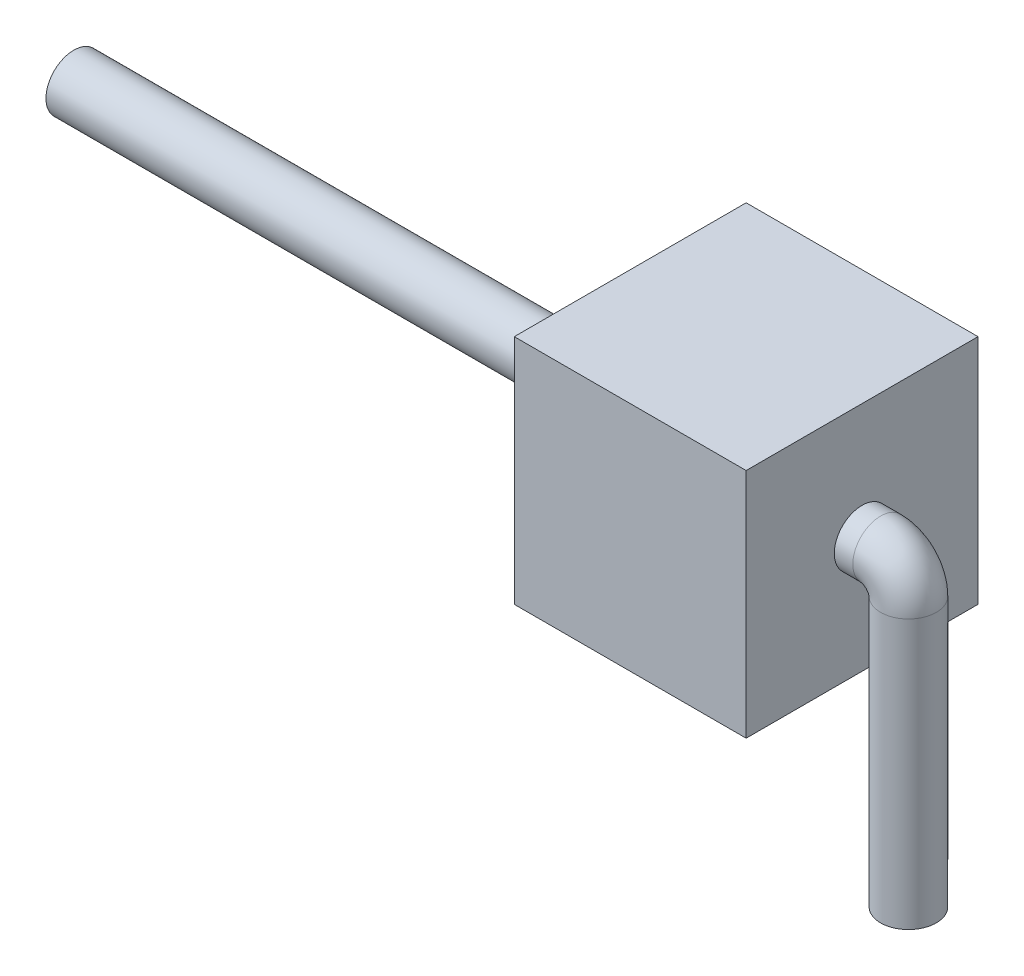
ISO-10303-21;
HEADER;
FILE_DESCRIPTION(('STEP AP214'),'2;1');
FILE_NAME('part.step','',(''),(''),'','','');
FILE_SCHEMA(('AUTOMOTIVE_DESIGN { 1 0 10303 214 1 1 1 1 }'));
ENDSEC;
DATA;
#1=APPLICATION_CONTEXT('core data for automotive mechanical design processes');
#2=APPLICATION_PROTOCOL_DEFINITION('international standard','automotive_design',2000,#1);
#3=PRODUCT_CONTEXT('',#1,'mechanical');
#4=PRODUCT('Part','Part','',(#3));
#5=PRODUCT_RELATED_PRODUCT_CATEGORY('part','',(#4));
#6=PRODUCT_DEFINITION_FORMATION('','',#4);
#7=PRODUCT_DEFINITION_CONTEXT('part definition',#1,'design');
#8=PRODUCT_DEFINITION('design','',#6,#7);
#9=PRODUCT_DEFINITION_SHAPE('','',#8);
#10=(LENGTH_UNIT() NAMED_UNIT(*) SI_UNIT(.MILLI.,.METRE.));
#11=(NAMED_UNIT(*) PLANE_ANGLE_UNIT() SI_UNIT($,.RADIAN.));
#12=(NAMED_UNIT(*) SI_UNIT($,.STERADIAN.) SOLID_ANGLE_UNIT());
#13=UNCERTAINTY_MEASURE_WITH_UNIT(LENGTH_MEASURE(1.E-05),#10,'distance_accuracy_value','');
#14=(GEOMETRIC_REPRESENTATION_CONTEXT(3) GLOBAL_UNCERTAINTY_ASSIGNED_CONTEXT((#13)) GLOBAL_UNIT_ASSIGNED_CONTEXT((#10,
#11,#12)) REPRESENTATION_CONTEXT('',''));
#15=CARTESIAN_POINT('',(0.,0.,0.));
#16=DIRECTION('',(0.,0.,1.));
#17=DIRECTION('',(1.,0.,0.));
#18=AXIS2_PLACEMENT_3D('',#15,#16,#17);
#19=CARTESIAN_POINT('',(1.25,-1.25,1.25));
#20=DIRECTION('',(1.,0.,0.));
#21=DIRECTION('',(0.,0.,-1.));
#22=AXIS2_PLACEMENT_3D('',#19,#20,#21);
#23=PLANE('',#22);
#24=DIRECTION('',(0.,-1.,0.));
#25=VECTOR('',#24,1.);
#26=CARTESIAN_POINT('',(1.25,1.25,1.25));
#27=LINE('',#26,#25);
#28=CARTESIAN_POINT('',(1.25,1.25,1.25));
#29=VERTEX_POINT('',#28);
#30=CARTESIAN_POINT('',(1.25,-1.25,1.25));
#31=VERTEX_POINT('',#30);
#32=EDGE_CURVE('E107',#29,#31,#27,.T.);
#33=ORIENTED_EDGE('',*,*,#32,.T.);
#34=DIRECTION('',(0.,0.,-1.));
#35=VECTOR('',#34,1.);
#36=CARTESIAN_POINT('',(1.25,-1.25,1.25));
#37=LINE('',#36,#35);
#38=CARTESIAN_POINT('',(1.25,-1.25,-1.25));
#39=VERTEX_POINT('',#38);
#40=EDGE_CURVE('E81',#31,#39,#37,.T.);
#41=ORIENTED_EDGE('',*,*,#40,.T.);
#42=DIRECTION('',(0.,1.,0.));
#43=VECTOR('',#42,1.);
#44=CARTESIAN_POINT('',(1.25,1.25,-1.25));
#45=LINE('',#44,#43);
#46=CARTESIAN_POINT('',(1.25,1.25,-1.25));
#47=VERTEX_POINT('',#46);
#48=EDGE_CURVE('E110',#39,#47,#45,.T.);
#49=ORIENTED_EDGE('',*,*,#48,.T.);
#50=DIRECTION('',(0.,0.,1.));
#51=VECTOR('',#50,1.);
#52=CARTESIAN_POINT('',(1.25,1.25,1.25));
#53=LINE('',#52,#51);
#54=EDGE_CURVE('E49',#47,#29,#53,.T.);
#55=ORIENTED_EDGE('',*,*,#54,.T.);
#56=EDGE_LOOP('',(#33,#41,#49,#55));
#57=FACE_BOUND('',#56,.T.);
#58=CARTESIAN_POINT('',(1.25,0.,0.));
#59=DIRECTION('',(1.,0.,0.));
#60=DIRECTION('',(0.,0.,-1.));
#61=AXIS2_PLACEMENT_3D('',#58,#59,#60);
#62=CIRCLE('',#61,0.3);
#63=CARTESIAN_POINT('',(1.25,0.,-0.3));
#64=VERTEX_POINT('',#63);
#65=EDGE_CURVE('E103',#64,#64,#62,.F.);
#66=ORIENTED_EDGE('',*,*,#65,.T.);
#67=EDGE_LOOP('',(#66));
#68=FACE_BOUND('',#67,.T.);
#69=ADVANCED_FACE('F32',(#57,#68),#23,.T.);
#70=CARTESIAN_POINT('',(-1.25,-1.25,1.25));
#71=DIRECTION('',(1.,0.,0.));
#72=DIRECTION('',(0.,0.,-1.));
#73=AXIS2_PLACEMENT_3D('',#70,#71,#72);
#74=PLANE('',#73);
#75=DIRECTION('',(0.,-1.,0.));
#76=VECTOR('',#75,1.);
#77=CARTESIAN_POINT('',(-1.25,1.25,1.25));
#78=LINE('',#77,#76);
#79=CARTESIAN_POINT('',(-1.25,1.25,1.25));
#80=VERTEX_POINT('',#79);
#81=CARTESIAN_POINT('',(-1.25,-1.25,1.25));
#82=VERTEX_POINT('',#81);
#83=EDGE_CURVE('E106',#80,#82,#78,.T.);
#84=ORIENTED_EDGE('',*,*,#83,.F.);
#85=DIRECTION('',(0.,0.,1.));
#86=VECTOR('',#85,1.);
#87=CARTESIAN_POINT('',(-1.25,1.25,1.25));
#88=LINE('',#87,#86);
#89=CARTESIAN_POINT('',(-1.25,1.25,-1.25));
#90=VERTEX_POINT('',#89);
#91=EDGE_CURVE('E73',#90,#80,#88,.T.);
#92=ORIENTED_EDGE('',*,*,#91,.F.);
#93=DIRECTION('',(0.,1.,0.));
#94=VECTOR('',#93,1.);
#95=CARTESIAN_POINT('',(-1.25,1.25,-1.25));
#96=LINE('',#95,#94);
#97=CARTESIAN_POINT('',(-1.25,-1.25,-1.25));
#98=VERTEX_POINT('',#97);
#99=EDGE_CURVE('E67',#98,#90,#96,.T.);
#100=ORIENTED_EDGE('',*,*,#99,.F.);
#101=DIRECTION('',(0.,0.,-1.));
#102=VECTOR('',#101,1.);
#103=CARTESIAN_POINT('',(-1.25,-1.25,1.25));
#104=LINE('',#103,#102);
#105=EDGE_CURVE('E116',#82,#98,#104,.T.);
#106=ORIENTED_EDGE('',*,*,#105,.F.);
#107=EDGE_LOOP('',(#84,#92,#100,#106));
#108=FACE_BOUND('',#107,.T.);
#109=CARTESIAN_POINT('',(-1.25,0.,0.));
#110=DIRECTION('',(1.,0.,0.));
#111=DIRECTION('',(0.,0.,-1.));
#112=AXIS2_PLACEMENT_3D('',#109,#110,#111);
#113=CIRCLE('',#112,0.3);
#114=CARTESIAN_POINT('',(-1.25,0.,-0.3));
#115=VERTEX_POINT('',#114);
#116=EDGE_CURVE('E11',#115,#115,#113,.F.);
#117=ORIENTED_EDGE('',*,*,#116,.F.);
#118=EDGE_LOOP('',(#117));
#119=FACE_BOUND('',#118,.T.);
#120=ADVANCED_FACE('F130',(#108,#119),#74,.F.);
#121=CARTESIAN_POINT('',(1.25,1.25,1.25));
#122=DIRECTION('',(0.,0.,-1.));
#123=DIRECTION('',(0.,1.,0.));
#124=AXIS2_PLACEMENT_3D('',#121,#122,#123);
#125=PLANE('',#124);
#126=ORIENTED_EDGE('',*,*,#83,.T.);
#127=DIRECTION('',(-1.,0.,0.));
#128=VECTOR('',#127,1.);
#129=CARTESIAN_POINT('',(1.25,-1.25,1.25));
#130=LINE('',#129,#128);
#131=EDGE_CURVE('E41',#31,#82,#130,.T.);
#132=ORIENTED_EDGE('',*,*,#131,.F.);
#133=ORIENTED_EDGE('',*,*,#32,.F.);
#134=DIRECTION('',(-1.,0.,0.));
#135=VECTOR('',#134,1.);
#136=CARTESIAN_POINT('',(1.25,1.25,1.25));
#137=LINE('',#136,#135);
#138=EDGE_CURVE('E113',#29,#80,#137,.T.);
#139=ORIENTED_EDGE('',*,*,#138,.T.);
#140=EDGE_LOOP('',(#126,#132,#133,#139));
#141=FACE_BOUND('',#140,.T.);
#142=ADVANCED_FACE('F34',(#141),#125,.F.);
#143=CARTESIAN_POINT('',(1.25,-1.25,1.25));
#144=DIRECTION('',(0.,1.,0.));
#145=DIRECTION('',(0.,0.,1.));
#146=AXIS2_PLACEMENT_3D('',#143,#144,#145);
#147=PLANE('',#146);
#148=ORIENTED_EDGE('',*,*,#105,.T.);
#149=DIRECTION('',(-1.,0.,0.));
#150=VECTOR('',#149,1.);
#151=CARTESIAN_POINT('',(1.25,-1.25,-1.25));
#152=LINE('',#151,#150);
#153=EDGE_CURVE('E123',#39,#98,#152,.T.);
#154=ORIENTED_EDGE('',*,*,#153,.F.);
#155=ORIENTED_EDGE('',*,*,#40,.F.);
#156=ORIENTED_EDGE('',*,*,#131,.T.);
#157=EDGE_LOOP('',(#148,#154,#155,#156));
#158=FACE_BOUND('',#157,.T.);
#159=ADVANCED_FACE('F125',(#158),#147,.F.);
#160=CARTESIAN_POINT('',(1.25,1.25,-1.25));
#161=DIRECTION('',(0.,0.,1.));
#162=DIRECTION('',(0.,-1.,0.));
#163=AXIS2_PLACEMENT_3D('',#160,#161,#162);
#164=PLANE('',#163);
#165=ORIENTED_EDGE('',*,*,#99,.T.);
#166=DIRECTION('',(-1.,0.,0.));
#167=VECTOR('',#166,1.);
#168=CARTESIAN_POINT('',(1.25,1.25,-1.25));
#169=LINE('',#168,#167);
#170=EDGE_CURVE('E121',#47,#90,#169,.T.);
#171=ORIENTED_EDGE('',*,*,#170,.F.);
#172=ORIENTED_EDGE('',*,*,#48,.F.);
#173=ORIENTED_EDGE('',*,*,#153,.T.);
#174=EDGE_LOOP('',(#165,#171,#172,#173));
#175=FACE_BOUND('',#174,.T.);
#176=ADVANCED_FACE('F163',(#175),#164,.F.);
#177=CARTESIAN_POINT('',(1.25,1.25,1.25));
#178=DIRECTION('',(0.,-1.,0.));
#179=DIRECTION('',(0.,0.,-1.));
#180=AXIS2_PLACEMENT_3D('',#177,#178,#179);
#181=PLANE('',#180);
#182=ORIENTED_EDGE('',*,*,#91,.T.);
#183=ORIENTED_EDGE('',*,*,#138,.F.);
#184=ORIENTED_EDGE('',*,*,#54,.F.);
#185=ORIENTED_EDGE('',*,*,#170,.T.);
#186=EDGE_LOOP('',(#182,#183,#184,#185));
#187=FACE_BOUND('',#186,.T.);
#188=ADVANCED_FACE('F148',(#187),#181,.F.);
#189=CARTESIAN_POINT('',(-7.25,0.,0.));
#190=DIRECTION('',(1.,0.,0.));
#191=DIRECTION('',(0.,0.,-1.));
#192=AXIS2_PLACEMENT_3D('',#189,#190,#191);
#193=PLANE('',#192);
#194=CARTESIAN_POINT('',(-7.25,0.,0.));
#195=DIRECTION('',(1.,0.,0.));
#196=DIRECTION('',(0.,0.,-1.));
#197=AXIS2_PLACEMENT_3D('',#194,#195,#196);
#198=CIRCLE('',#197,0.3);
#199=CARTESIAN_POINT('',(-7.25,0.,-0.3));
#200=VERTEX_POINT('',#199);
#201=EDGE_CURVE('E96',#200,#200,#198,.T.);
#202=ORIENTED_EDGE('',*,*,#201,.F.);
#203=EDGE_LOOP('',(#202));
#204=FACE_BOUND('',#203,.T.);
#205=ADVANCED_FACE('F138',(#204),#193,.F.);
#206=CARTESIAN_POINT('',(1.45,0.,0.));
#207=DIRECTION('',(-1.,0.,0.));
#208=DIRECTION('',(0.,0.,1.));
#209=AXIS2_PLACEMENT_3D('',#206,#207,#208);
#210=CYLINDRICAL_SURFACE('',#209,0.3);
#211=ORIENTED_EDGE('',*,*,#201,.T.);
#212=EDGE_LOOP('',(#211));
#213=FACE_BOUND('',#212,.T.);
#214=ORIENTED_EDGE('',*,*,#116,.T.);
#215=EDGE_LOOP('',(#214));
#216=FACE_BOUND('',#215,.T.);
#217=ADVANCED_FACE('F136',(#213,#216),#210,.T.);
#218=CARTESIAN_POINT('',(1.75,-0.300000000000003,0.));
#219=DIRECTION('',(0.,-1.,0.));
#220=DIRECTION('',(0.,0.,-1.));
#221=AXIS2_PLACEMENT_3D('',#218,#219,#220);
#222=CYLINDRICAL_SURFACE('',#221,0.3);
#223=CARTESIAN_POINT('',(1.75,-3.2,0.));
#224=DIRECTION('',(0.,-1.,0.));
#225=DIRECTION('',(0.,0.,-1.));
#226=AXIS2_PLACEMENT_3D('',#223,#224,#225);
#227=CIRCLE('',#226,0.3);
#228=CARTESIAN_POINT('',(1.75,-3.2,-0.3));
#229=VERTEX_POINT('',#228);
#230=EDGE_CURVE('E91',#229,#229,#227,.T.);
#231=ORIENTED_EDGE('',*,*,#230,.F.);
#232=EDGE_LOOP('',(#231));
#233=FACE_BOUND('',#232,.T.);
#234=CARTESIAN_POINT('',(1.75,-0.300000000000003,0.));
#235=DIRECTION('',(0.,-1.,0.));
#236=DIRECTION('',(0.,0.,-1.));
#237=AXIS2_PLACEMENT_3D('',#234,#235,#236);
#238=CIRCLE('',#237,0.3);
#239=CARTESIAN_POINT('',(1.45,-0.3,0.));
#240=VERTEX_POINT('',#239);
#241=EDGE_CURVE('E86',#240,#240,#238,.T.);
#242=ORIENTED_EDGE('',*,*,#241,.T.);
#243=EDGE_LOOP('',(#242));
#244=FACE_BOUND('',#243,.T.);
#245=ADVANCED_FACE('F88',(#233,#244),#222,.T.);
#246=CARTESIAN_POINT('',(1.15,-0.3,0.));
#247=DIRECTION('',(0.,-1.,0.));
#248=DIRECTION('',(-1.,0.,0.));
#249=AXIS2_PLACEMENT_3D('',#246,#247,#248);
#250=CIRCLE('',#249,0.3);
#251=TRIMMED_CURVE('',#250,(PARAMETER_VALUE(-3.14159260416823)),
(PARAMETER_VALUE(3.14159260416823)),.T.,.PARAMETER.);
#252=CARTESIAN_POINT('',(1.45,-0.3,0.));
#253=DIRECTION('',(0.,0.,-1.));
#254=AXIS1_PLACEMENT('',#252,#253);
#255=SURFACE_OF_REVOLUTION('',#251,#254);
#256=CARTESIAN_POINT('',(1.45,0.,0.));
#257=DIRECTION('',(1.,0.,0.));
#258=DIRECTION('',(0.,0.,-1.));
#259=AXIS2_PLACEMENT_3D('',#256,#257,#258);
#260=CIRCLE('',#259,0.3);
#261=EDGE_CURVE('E92',#240,#240,#260,.T.);
#262=ORIENTED_EDGE('',*,*,#261,.T.);
#263=ORIENTED_EDGE('',*,*,#241,.F.);
#264=EDGE_LOOP('',(#262,#263));
#265=FACE_BOUND('',#264,.T.);
#266=ADVANCED_FACE('F94',(#265),#255,.T.);
#267=ORIENTED_EDGE('',*,*,#65,.F.);
#268=EDGE_LOOP('',(#267));
#269=FACE_BOUND('',#268,.T.);
#270=ORIENTED_EDGE('',*,*,#261,.F.);
#271=EDGE_LOOP('',(#270));
#272=FACE_BOUND('',#271,.T.);
#273=ADVANCED_FACE('F141',(#269,#272),#210,.T.);
#274=CARTESIAN_POINT('',(1.75,-3.2,0.));
#275=DIRECTION('',(0.,-1.,0.));
#276=DIRECTION('',(0.,0.,-1.));
#277=AXIS2_PLACEMENT_3D('',#274,#275,#276);
#278=PLANE('',#277);
#279=ORIENTED_EDGE('',*,*,#230,.T.);
#280=EDGE_LOOP('',(#279));
#281=FACE_BOUND('',#280,.T.);
#282=ADVANCED_FACE('F153',(#281),#278,.T.);
#283=CLOSED_SHELL('',(#69,#120,#142,#159,#176,#188,#205,#217,#245,#266,#273,#282));
#284=MANIFOLD_SOLID_BREP('B2',#283);
#285=ADVANCED_BREP_SHAPE_REPRESENTATION('',(#18,#284),#14);
#286=SHAPE_DEFINITION_REPRESENTATION(#9,#285);
ENDSEC;
END-ISO-10303-21;
